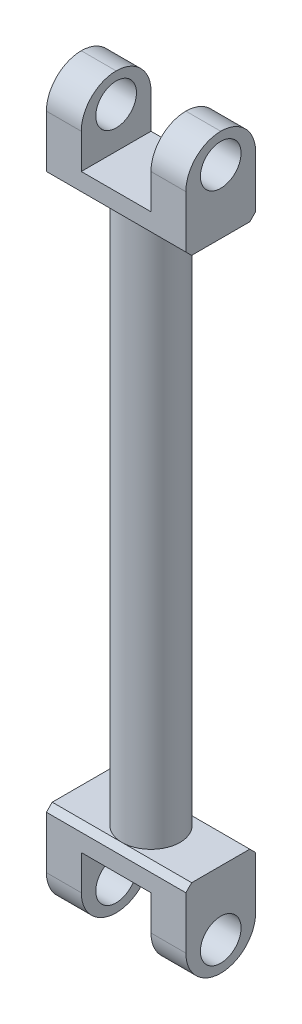
ISO-10303-21;
HEADER;
FILE_DESCRIPTION(('STEP AP214'),'2;1');
FILE_NAME('part.step','',(''),(''),'','','');
FILE_SCHEMA(('AUTOMOTIVE_DESIGN { 1 0 10303 214 1 1 1 1 }'));
ENDSEC;
DATA;
#1=APPLICATION_CONTEXT('core data for automotive mechanical design processes');
#2=APPLICATION_PROTOCOL_DEFINITION('international standard','automotive_design',2000,#1);
#3=PRODUCT_CONTEXT('',#1,'mechanical');
#4=PRODUCT('Part','Part','',(#3));
#5=PRODUCT_RELATED_PRODUCT_CATEGORY('part','',(#4));
#6=PRODUCT_DEFINITION_FORMATION('','',#4);
#7=PRODUCT_DEFINITION_CONTEXT('part definition',#1,'design');
#8=PRODUCT_DEFINITION('design','',#6,#7);
#9=PRODUCT_DEFINITION_SHAPE('','',#8);
#10=(LENGTH_UNIT() NAMED_UNIT(*) SI_UNIT(.MILLI.,.METRE.));
#11=(NAMED_UNIT(*) PLANE_ANGLE_UNIT() SI_UNIT($,.RADIAN.));
#12=(NAMED_UNIT(*) SI_UNIT($,.STERADIAN.) SOLID_ANGLE_UNIT());
#13=UNCERTAINTY_MEASURE_WITH_UNIT(LENGTH_MEASURE(1.E-05),#10,'distance_accuracy_value','');
#14=(GEOMETRIC_REPRESENTATION_CONTEXT(3) GLOBAL_UNCERTAINTY_ASSIGNED_CONTEXT((#13)) GLOBAL_UNIT_ASSIGNED_CONTEXT((#10,
#11,#12)) REPRESENTATION_CONTEXT('',''));
#15=CARTESIAN_POINT('',(0.,0.,0.));
#16=DIRECTION('',(0.,0.,1.));
#17=DIRECTION('',(1.,0.,0.));
#18=AXIS2_PLACEMENT_3D('',#15,#16,#17);
#19=CARTESIAN_POINT('',(0.,-23.375,0.));
#20=DIRECTION('',(0.,1.,0.));
#21=DIRECTION('',(0.,0.,-1.));
#22=AXIS2_PLACEMENT_3D('',#19,#20,#21);
#23=PLANE('',#22);
#24=DIRECTION('',(0.,0.,-1.));
#25=VECTOR('',#24,1.);
#26=CARTESIAN_POINT('',(6.,-23.375,3.));
#27=LINE('',#26,#25);
#28=CARTESIAN_POINT('',(6.,-23.375,2.5));
#29=VERTEX_POINT('',#28);
#30=CARTESIAN_POINT('',(6.,-23.375,-2.5));
#31=VERTEX_POINT('',#30);
#32=EDGE_CURVE('E247',#29,#31,#27,.T.);
#33=ORIENTED_EDGE('',*,*,#32,.T.);
#34=DIRECTION('',(-1.,0.,0.));
#35=VECTOR('',#34,1.);
#36=CARTESIAN_POINT('',(0.,-23.375,-2.5));
#37=LINE('',#36,#35);
#38=CARTESIAN_POINT('',(0.,-23.375,-2.5));
#39=VERTEX_POINT('',#38);
#40=EDGE_CURVE('E416',#31,#39,#37,.T.);
#41=ORIENTED_EDGE('',*,*,#40,.T.);
#42=CARTESIAN_POINT('',(0.,-23.375,0.));
#43=DIRECTION('',(0.,1.,0.));
#44=DIRECTION('',(0.,0.,1.));
#45=AXIS2_PLACEMENT_3D('',#42,#43,#44);
#46=CIRCLE('',#45,2.5);
#47=CARTESIAN_POINT('',(0.,-23.375,2.5));
#48=VERTEX_POINT('',#47);
#49=EDGE_CURVE('E318',#48,#39,#46,.T.);
#50=ORIENTED_EDGE('',*,*,#49,.F.);
#51=DIRECTION('',(1.,0.,0.));
#52=VECTOR('',#51,1.);
#53=CARTESIAN_POINT('',(0.,-23.375,2.5));
#54=LINE('',#53,#52);
#55=EDGE_CURVE('E402',#48,#29,#54,.T.);
#56=ORIENTED_EDGE('',*,*,#55,.T.);
#57=EDGE_LOOP('',(#33,#41,#50,#56));
#58=FACE_BOUND('',#57,.T.);
#59=ADVANCED_FACE('F37',(#58),#23,.T.);
#60=CARTESIAN_POINT('',(0.,23.375,0.));
#61=DIRECTION('',(0.,-1.,0.));
#62=DIRECTION('',(0.,0.,-1.));
#63=AXIS2_PLACEMENT_3D('',#60,#61,#62);
#64=PLANE('',#63);
#65=DIRECTION('',(0.,0.,1.));
#66=VECTOR('',#65,1.);
#67=CARTESIAN_POINT('',(-6.,23.375,3.));
#68=LINE('',#67,#66);
#69=CARTESIAN_POINT('',(-6.,23.375,-2.5));
#70=VERTEX_POINT('',#69);
#71=CARTESIAN_POINT('',(-6.,23.375,2.5));
#72=VERTEX_POINT('',#71);
#73=EDGE_CURVE('E294',#70,#72,#68,.T.);
#74=ORIENTED_EDGE('',*,*,#73,.F.);
#75=DIRECTION('',(1.,0.,0.));
#76=VECTOR('',#75,1.);
#77=CARTESIAN_POINT('',(6.,23.375,-2.5));
#78=LINE('',#77,#76);
#79=CARTESIAN_POINT('',(0.,23.375,-2.5));
#80=VERTEX_POINT('',#79);
#81=EDGE_CURVE('E366',#70,#80,#78,.T.);
#82=ORIENTED_EDGE('',*,*,#81,.T.);
#83=CARTESIAN_POINT('',(0.,23.375,0.));
#84=DIRECTION('',(0.,1.,0.));
#85=DIRECTION('',(0.,0.,1.));
#86=AXIS2_PLACEMENT_3D('',#83,#84,#85);
#87=CIRCLE('',#86,2.5);
#88=CARTESIAN_POINT('',(0.,23.375,2.5));
#89=VERTEX_POINT('',#88);
#90=EDGE_CURVE('E313',#80,#89,#87,.T.);
#91=ORIENTED_EDGE('',*,*,#90,.T.);
#92=DIRECTION('',(-1.,0.,0.));
#93=VECTOR('',#92,1.);
#94=CARTESIAN_POINT('',(-6.,23.375,2.5));
#95=LINE('',#94,#93);
#96=EDGE_CURVE('E360',#89,#72,#95,.T.);
#97=ORIENTED_EDGE('',*,*,#96,.T.);
#98=EDGE_LOOP('',(#74,#82,#91,#97));
#99=FACE_BOUND('',#98,.T.);
#100=ADVANCED_FACE('F459',(#99),#64,.T.);
#101=CARTESIAN_POINT('',(0.,25.375,0.));
#102=DIRECTION('',(0.,-1.,0.));
#103=DIRECTION('',(0.,0.,-1.));
#104=AXIS2_PLACEMENT_3D('',#101,#102,#103);
#105=PLANE('',#104);
#106=DIRECTION('',(0.,0.,1.));
#107=VECTOR('',#106,1.);
#108=CARTESIAN_POINT('',(3.,25.375,-3.));
#109=LINE('',#108,#107);
#110=CARTESIAN_POINT('',(3.,25.375,-3.));
#111=VERTEX_POINT('',#110);
#112=CARTESIAN_POINT('',(3.,25.375,3.));
#113=VERTEX_POINT('',#112);
#114=EDGE_CURVE('E275',#111,#113,#109,.T.);
#115=ORIENTED_EDGE('',*,*,#114,.F.);
#116=DIRECTION('',(-1.,0.,0.));
#117=VECTOR('',#116,1.);
#118=CARTESIAN_POINT('',(-6.,25.375,-3.));
#119=LINE('',#118,#117);
#120=CARTESIAN_POINT('',(-3.,25.375,-3.));
#121=VERTEX_POINT('',#120);
#122=EDGE_CURVE('E290',#111,#121,#119,.T.);
#123=ORIENTED_EDGE('',*,*,#122,.T.);
#124=DIRECTION('',(0.,0.,-1.));
#125=VECTOR('',#124,1.);
#126=CARTESIAN_POINT('',(-3.,25.375,-3.));
#127=LINE('',#126,#125);
#128=CARTESIAN_POINT('',(-3.,25.375,3.));
#129=VERTEX_POINT('',#128);
#130=EDGE_CURVE('E282',#129,#121,#127,.T.);
#131=ORIENTED_EDGE('',*,*,#130,.F.);
#132=DIRECTION('',(1.,0.,0.));
#133=VECTOR('',#132,1.);
#134=CARTESIAN_POINT('',(-6.,25.375,3.));
#135=LINE('',#134,#133);
#136=EDGE_CURVE('E293',#129,#113,#135,.T.);
#137=ORIENTED_EDGE('',*,*,#136,.T.);
#138=EDGE_LOOP('',(#115,#123,#131,#137));
#139=FACE_BOUND('',#138,.T.);
#140=ADVANCED_FACE('F449',(#139),#105,.F.);
#141=CARTESIAN_POINT('',(0.,23.375,0.));
#142=DIRECTION('',(0.,-1.,0.));
#143=DIRECTION('',(0.,0.,-1.));
#144=AXIS2_PLACEMENT_3D('',#141,#142,#143);
#145=CYLINDRICAL_SURFACE('',#144,2.5);
#146=EDGE_CURVE('E314',#89,#80,#87,.T.);
#147=ORIENTED_EDGE('',*,*,#146,.F.);
#148=ORIENTED_EDGE('',*,*,#90,.F.);
#149=EDGE_LOOP('',(#147,#148));
#150=FACE_BOUND('',#149,.T.);
#151=ORIENTED_EDGE('',*,*,#49,.T.);
#152=EDGE_CURVE('E263',#39,#48,#46,.T.);
#153=ORIENTED_EDGE('',*,*,#152,.T.);
#154=EDGE_LOOP('',(#151,#153));
#155=FACE_BOUND('',#154,.T.);
#156=ADVANCED_FACE('F446',(#150,#155),#145,.T.);
#157=CARTESIAN_POINT('',(6.,25.375,3.));
#158=DIRECTION('',(-1.,0.,0.));
#159=DIRECTION('',(0.,0.,1.));
#160=AXIS2_PLACEMENT_3D('',#157,#158,#159);
#161=PLANE('',#160);
#162=CARTESIAN_POINT('',(6.,28.875,0.));
#163=DIRECTION('',(-1.,0.,0.));
#164=DIRECTION('',(0.,0.,1.));
#165=AXIS2_PLACEMENT_3D('',#162,#163,#164);
#166=CIRCLE('',#165,1.75);
#167=CARTESIAN_POINT('',(6.,28.875,1.75));
#168=VERTEX_POINT('',#167);
#169=EDGE_CURVE('E264',#168,#168,#166,.T.);
#170=ORIENTED_EDGE('',*,*,#169,.T.);
#171=EDGE_LOOP('',(#170));
#172=FACE_BOUND('',#171,.T.);
#173=DIRECTION('',(0.,0.,-1.));
#174=VECTOR('',#173,1.);
#175=CARTESIAN_POINT('',(6.,23.375,3.));
#176=LINE('',#175,#174);
#177=CARTESIAN_POINT('',(6.,23.375,2.5));
#178=VERTEX_POINT('',#177);
#179=CARTESIAN_POINT('',(6.,23.375,-2.5));
#180=VERTEX_POINT('',#179);
#181=EDGE_CURVE('E289',#178,#180,#176,.T.);
#182=ORIENTED_EDGE('',*,*,#181,.T.);
#183=DIRECTION('',(0.,0.707106781186543,-0.707106781186552));
#184=VECTOR('',#183,1.);
#185=CARTESIAN_POINT('',(6.,23.875,-3.));
#186=LINE('',#185,#184);
#187=CARTESIAN_POINT('',(6.,23.875,-3.));
#188=VERTEX_POINT('',#187);
#189=EDGE_CURVE('E370',#180,#188,#186,.T.);
#190=ORIENTED_EDGE('',*,*,#189,.T.);
#191=DIRECTION('',(0.,-1.,0.));
#192=VECTOR('',#191,1.);
#193=CARTESIAN_POINT('',(6.,25.375,-3.));
#194=LINE('',#193,#192);
#195=CARTESIAN_POINT('',(6.,28.375,-3.));
#196=VERTEX_POINT('',#195);
#197=EDGE_CURVE('E310',#196,#188,#194,.T.);
#198=ORIENTED_EDGE('',*,*,#197,.F.);
#199=CARTESIAN_POINT('',(6.,28.375,0.));
#200=DIRECTION('',(-1.,0.,0.));
#201=DIRECTION('',(0.,0.,1.));
#202=AXIS2_PLACEMENT_3D('',#199,#200,#201);
#203=CIRCLE('',#202,3.);
#204=CARTESIAN_POINT('',(6.,31.375,0.));
#205=VERTEX_POINT('',#204);
#206=EDGE_CURVE('E317',#196,#205,#203,.F.);
#207=ORIENTED_EDGE('',*,*,#206,.T.);
#208=CARTESIAN_POINT('',(6.,28.375,0.));
#209=DIRECTION('',(-1.,0.,0.));
#210=DIRECTION('',(0.,0.,1.));
#211=AXIS2_PLACEMENT_3D('',#208,#209,#210);
#212=CIRCLE('',#211,3.);
#213=CARTESIAN_POINT('',(6.,28.375,3.));
#214=VERTEX_POINT('',#213);
#215=EDGE_CURVE('E325',#205,#214,#212,.F.);
#216=ORIENTED_EDGE('',*,*,#215,.T.);
#217=DIRECTION('',(0.,-1.,0.));
#218=VECTOR('',#217,1.);
#219=CARTESIAN_POINT('',(6.,25.375,3.));
#220=LINE('',#219,#218);
#221=CARTESIAN_POINT('',(6.,23.875,3.));
#222=VERTEX_POINT('',#221);
#223=EDGE_CURVE('E297',#214,#222,#220,.T.);
#224=ORIENTED_EDGE('',*,*,#223,.T.);
#225=DIRECTION('',(0.,-0.707106781186543,-0.707106781186552));
#226=VECTOR('',#225,1.);
#227=CARTESIAN_POINT('',(6.,23.875,3.));
#228=LINE('',#227,#226);
#229=EDGE_CURVE('E368',#222,#178,#228,.T.);
#230=ORIENTED_EDGE('',*,*,#229,.T.);
#231=EDGE_LOOP('',(#182,#190,#198,#207,#216,#224,#230));
#232=FACE_BOUND('',#231,.T.);
#233=ADVANCED_FACE('F448',(#172,#232),#161,.F.);
#234=CARTESIAN_POINT('',(-6.,25.375,-3.));
#235=DIRECTION('',(0.,0.,1.));
#236=DIRECTION('',(1.,0.,0.));
#237=AXIS2_PLACEMENT_3D('',#234,#235,#236);
#238=PLANE('',#237);
#239=ORIENTED_EDGE('',*,*,#197,.T.);
#240=DIRECTION('',(-1.,0.,0.));
#241=VECTOR('',#240,1.);
#242=CARTESIAN_POINT('',(-6.,23.875,-3.));
#243=LINE('',#242,#241);
#244=CARTESIAN_POINT('',(-6.,23.875,-3.));
#245=VERTEX_POINT('',#244);
#246=EDGE_CURVE('E349',#188,#245,#243,.T.);
#247=ORIENTED_EDGE('',*,*,#246,.T.);
#248=DIRECTION('',(0.,-1.,0.));
#249=VECTOR('',#248,1.);
#250=CARTESIAN_POINT('',(-6.,25.375,-3.));
#251=LINE('',#250,#249);
#252=CARTESIAN_POINT('',(-6.,28.375,-3.));
#253=VERTEX_POINT('',#252);
#254=EDGE_CURVE('E307',#253,#245,#251,.T.);
#255=ORIENTED_EDGE('',*,*,#254,.F.);
#256=DIRECTION('',(-1.,0.,0.));
#257=VECTOR('',#256,1.);
#258=CARTESIAN_POINT('',(-3.,28.375,-3.));
#259=LINE('',#258,#257);
#260=CARTESIAN_POINT('',(-3.,28.375,-3.));
#261=VERTEX_POINT('',#260);
#262=EDGE_CURVE('E337',#253,#261,#259,.F.);
#263=ORIENTED_EDGE('',*,*,#262,.T.);
#264=DIRECTION('',(0.,-1.,0.));
#265=VECTOR('',#264,1.);
#266=CARTESIAN_POINT('',(-3.,31.375,-3.));
#267=LINE('',#266,#265);
#268=EDGE_CURVE('E285',#261,#121,#267,.T.);
#269=ORIENTED_EDGE('',*,*,#268,.T.);
#270=ORIENTED_EDGE('',*,*,#122,.F.);
#271=DIRECTION('',(0.,-1.,0.));
#272=VECTOR('',#271,1.);
#273=CARTESIAN_POINT('',(3.,31.375,-3.));
#274=LINE('',#273,#272);
#275=CARTESIAN_POINT('',(3.,28.375,-3.));
#276=VERTEX_POINT('',#275);
#277=EDGE_CURVE('E280',#276,#111,#274,.T.);
#278=ORIENTED_EDGE('',*,*,#277,.F.);
#279=DIRECTION('',(-1.,0.,0.));
#280=VECTOR('',#279,1.);
#281=CARTESIAN_POINT('',(-6.,28.375,-3.));
#282=LINE('',#281,#280);
#283=EDGE_CURVE('E339',#276,#196,#282,.F.);
#284=ORIENTED_EDGE('',*,*,#283,.T.);
#285=EDGE_LOOP('',(#239,#247,#255,#263,#269,#270,#278,#284));
#286=FACE_BOUND('',#285,.T.);
#287=ADVANCED_FACE('F456',(#286),#238,.F.);
#288=CARTESIAN_POINT('',(-6.,25.375,3.));
#289=DIRECTION('',(1.,0.,0.));
#290=DIRECTION('',(0.,0.,-1.));
#291=AXIS2_PLACEMENT_3D('',#288,#289,#290);
#292=PLANE('',#291);
#293=CARTESIAN_POINT('',(-6.,28.875,0.));
#294=DIRECTION('',(-1.,0.,0.));
#295=DIRECTION('',(0.,0.,1.));
#296=AXIS2_PLACEMENT_3D('',#293,#294,#295);
#297=CIRCLE('',#296,1.75);
#298=CARTESIAN_POINT('',(-6.,28.875,1.75));
#299=VERTEX_POINT('',#298);
#300=EDGE_CURVE('E268',#299,#299,#297,.T.);
#301=ORIENTED_EDGE('',*,*,#300,.F.);
#302=EDGE_LOOP('',(#301));
#303=FACE_BOUND('',#302,.T.);
#304=ORIENTED_EDGE('',*,*,#254,.T.);
#305=DIRECTION('',(0.,-0.707106781186543,0.707106781186552));
#306=VECTOR('',#305,1.);
#307=CARTESIAN_POINT('',(-6.,23.875,-3.));
#308=LINE('',#307,#306);
#309=EDGE_CURVE('E358',#245,#70,#308,.T.);
#310=ORIENTED_EDGE('',*,*,#309,.T.);
#311=ORIENTED_EDGE('',*,*,#73,.T.);
#312=DIRECTION('',(0.,0.707106781186543,0.707106781186552));
#313=VECTOR('',#312,1.);
#314=CARTESIAN_POINT('',(-6.,23.875,3.));
#315=LINE('',#314,#313);
#316=CARTESIAN_POINT('',(-6.,23.875,3.));
#317=VERTEX_POINT('',#316);
#318=EDGE_CURVE('E356',#72,#317,#315,.T.);
#319=ORIENTED_EDGE('',*,*,#318,.T.);
#320=DIRECTION('',(0.,-1.,0.));
#321=VECTOR('',#320,1.);
#322=CARTESIAN_POINT('',(-6.,25.375,3.));
#323=LINE('',#322,#321);
#324=CARTESIAN_POINT('',(-6.,28.375,3.));
#325=VERTEX_POINT('',#324);
#326=EDGE_CURVE('E304',#325,#317,#323,.T.);
#327=ORIENTED_EDGE('',*,*,#326,.F.);
#328=CARTESIAN_POINT('',(-6.,28.375,0.));
#329=DIRECTION('',(1.,0.,0.));
#330=DIRECTION('',(0.,0.,-1.));
#331=AXIS2_PLACEMENT_3D('',#328,#329,#330);
#332=CIRCLE('',#331,3.);
#333=CARTESIAN_POINT('',(-6.,31.375,0.));
#334=VERTEX_POINT('',#333);
#335=EDGE_CURVE('E347',#325,#334,#332,.F.);
#336=ORIENTED_EDGE('',*,*,#335,.T.);
#337=CARTESIAN_POINT('',(-6.,28.375,0.));
#338=DIRECTION('',(1.,0.,0.));
#339=DIRECTION('',(0.,0.,-1.));
#340=AXIS2_PLACEMENT_3D('',#337,#338,#339);
#341=CIRCLE('',#340,3.);
#342=EDGE_CURVE('E345',#334,#253,#341,.F.);
#343=ORIENTED_EDGE('',*,*,#342,.T.);
#344=EDGE_LOOP('',(#304,#310,#311,#319,#327,#336,#343));
#345=FACE_BOUND('',#344,.T.);
#346=ADVANCED_FACE('F692',(#303,#345),#292,.F.);
#347=CARTESIAN_POINT('',(-6.,25.375,3.));
#348=DIRECTION('',(0.,0.,-1.));
#349=DIRECTION('',(-1.,0.,0.));
#350=AXIS2_PLACEMENT_3D('',#347,#348,#349);
#351=PLANE('',#350);
#352=ORIENTED_EDGE('',*,*,#326,.T.);
#353=DIRECTION('',(1.,0.,0.));
#354=VECTOR('',#353,1.);
#355=CARTESIAN_POINT('',(6.,23.875,3.));
#356=LINE('',#355,#354);
#357=EDGE_CURVE('E372',#317,#222,#356,.T.);
#358=ORIENTED_EDGE('',*,*,#357,.T.);
#359=ORIENTED_EDGE('',*,*,#223,.F.);
#360=DIRECTION('',(1.,0.,0.));
#361=VECTOR('',#360,1.);
#362=CARTESIAN_POINT('',(-6.,28.375,3.));
#363=LINE('',#362,#361);
#364=CARTESIAN_POINT('',(3.,28.375,3.));
#365=VERTEX_POINT('',#364);
#366=EDGE_CURVE('E330',#214,#365,#363,.F.);
#367=ORIENTED_EDGE('',*,*,#366,.T.);
#368=DIRECTION('',(0.,-1.,0.));
#369=VECTOR('',#368,1.);
#370=CARTESIAN_POINT('',(3.,31.375,3.));
#371=LINE('',#370,#369);
#372=EDGE_CURVE('E278',#365,#113,#371,.T.);
#373=ORIENTED_EDGE('',*,*,#372,.T.);
#374=ORIENTED_EDGE('',*,*,#136,.F.);
#375=DIRECTION('',(0.,-1.,0.));
#376=VECTOR('',#375,1.);
#377=CARTESIAN_POINT('',(-3.,31.375,3.));
#378=LINE('',#377,#376);
#379=CARTESIAN_POINT('',(-3.,28.375,3.));
#380=VERTEX_POINT('',#379);
#381=EDGE_CURVE('E287',#380,#129,#378,.T.);
#382=ORIENTED_EDGE('',*,*,#381,.F.);
#383=DIRECTION('',(1.,0.,0.));
#384=VECTOR('',#383,1.);
#385=CARTESIAN_POINT('',(-6.,28.375,3.));
#386=LINE('',#385,#384);
#387=EDGE_CURVE('E327',#380,#325,#386,.F.);
#388=ORIENTED_EDGE('',*,*,#387,.T.);
#389=EDGE_LOOP('',(#352,#358,#359,#367,#373,#374,#382,#388));
#390=FACE_BOUND('',#389,.T.);
#391=ADVANCED_FACE('F680',(#390),#351,.F.);
#392=ORIENTED_EDGE('',*,*,#146,.T.);
#393=DIRECTION('',(1.,0.,0.));
#394=VECTOR('',#393,1.);
#395=CARTESIAN_POINT('',(6.,23.375,-2.5));
#396=LINE('',#395,#394);
#397=EDGE_CURVE('E364',#80,#180,#396,.T.);
#398=ORIENTED_EDGE('',*,*,#397,.T.);
#399=ORIENTED_EDGE('',*,*,#181,.F.);
#400=DIRECTION('',(-1.,0.,0.));
#401=VECTOR('',#400,1.);
#402=CARTESIAN_POINT('',(-6.,23.375,2.5));
#403=LINE('',#402,#401);
#404=EDGE_CURVE('E362',#178,#89,#403,.T.);
#405=ORIENTED_EDGE('',*,*,#404,.T.);
#406=EDGE_LOOP('',(#392,#398,#399,#405));
#407=FACE_BOUND('',#406,.T.);
#408=ADVANCED_FACE('F471',(#407),#64,.T.);
#409=CARTESIAN_POINT('',(-3.,31.375,-3.));
#410=DIRECTION('',(-1.,0.,0.));
#411=DIRECTION('',(0.,0.,1.));
#412=AXIS2_PLACEMENT_3D('',#409,#410,#411);
#413=PLANE('',#412);
#414=CARTESIAN_POINT('',(-3.,28.875,0.));
#415=DIRECTION('',(-1.,0.,0.));
#416=DIRECTION('',(0.,0.,1.));
#417=AXIS2_PLACEMENT_3D('',#414,#415,#416);
#418=CIRCLE('',#417,1.75);
#419=CARTESIAN_POINT('',(-3.,28.875,1.75));
#420=VERTEX_POINT('',#419);
#421=EDGE_CURVE('E272',#420,#420,#418,.T.);
#422=ORIENTED_EDGE('',*,*,#421,.T.);
#423=EDGE_LOOP('',(#422));
#424=FACE_BOUND('',#423,.T.);
#425=CARTESIAN_POINT('',(-3.,28.375,0.));
#426=DIRECTION('',(-1.,0.,0.));
#427=DIRECTION('',(0.,0.,1.));
#428=AXIS2_PLACEMENT_3D('',#425,#426,#427);
#429=CIRCLE('',#428,3.);
#430=CARTESIAN_POINT('',(-3.,31.375,0.));
#431=VERTEX_POINT('',#430);
#432=EDGE_CURVE('E341',#261,#431,#429,.F.);
#433=ORIENTED_EDGE('',*,*,#432,.T.);
#434=CARTESIAN_POINT('',(-3.,28.375,0.));
#435=DIRECTION('',(-1.,0.,0.));
#436=DIRECTION('',(0.,0.,1.));
#437=AXIS2_PLACEMENT_3D('',#434,#435,#436);
#438=CIRCLE('',#437,3.);
#439=EDGE_CURVE('E343',#431,#380,#438,.F.);
#440=ORIENTED_EDGE('',*,*,#439,.T.);
#441=ORIENTED_EDGE('',*,*,#381,.T.);
#442=ORIENTED_EDGE('',*,*,#130,.T.);
#443=ORIENTED_EDGE('',*,*,#268,.F.);
#444=EDGE_LOOP('',(#433,#440,#441,#442,#443));
#445=FACE_BOUND('',#444,.T.);
#446=ADVANCED_FACE('F679',(#424,#445),#413,.F.);
#447=CARTESIAN_POINT('',(3.,31.375,-3.));
#448=DIRECTION('',(1.,0.,0.));
#449=DIRECTION('',(0.,0.,-1.));
#450=AXIS2_PLACEMENT_3D('',#447,#448,#449);
#451=PLANE('',#450);
#452=CARTESIAN_POINT('',(3.,28.875,0.));
#453=DIRECTION('',(1.,0.,0.));
#454=DIRECTION('',(0.,0.,-1.));
#455=AXIS2_PLACEMENT_3D('',#452,#453,#454);
#456=CIRCLE('',#455,1.75);
#457=CARTESIAN_POINT('',(3.,28.875,-1.75));
#458=VERTEX_POINT('',#457);
#459=EDGE_CURVE('E267',#458,#458,#456,.T.);
#460=ORIENTED_EDGE('',*,*,#459,.T.);
#461=EDGE_LOOP('',(#460));
#462=FACE_BOUND('',#461,.T.);
#463=ORIENTED_EDGE('',*,*,#372,.F.);
#464=CARTESIAN_POINT('',(3.,28.375,0.));
#465=DIRECTION('',(1.,0.,0.));
#466=DIRECTION('',(0.,0.,-1.));
#467=AXIS2_PLACEMENT_3D('',#464,#465,#466);
#468=CIRCLE('',#467,3.);
#469=CARTESIAN_POINT('',(3.,31.375,0.));
#470=VERTEX_POINT('',#469);
#471=EDGE_CURVE('E335',#365,#470,#468,.F.);
#472=ORIENTED_EDGE('',*,*,#471,.T.);
#473=CARTESIAN_POINT('',(3.,28.375,0.));
#474=DIRECTION('',(1.,0.,0.));
#475=DIRECTION('',(0.,0.,-1.));
#476=AXIS2_PLACEMENT_3D('',#473,#474,#475);
#477=CIRCLE('',#476,3.);
#478=EDGE_CURVE('E333',#470,#276,#477,.F.);
#479=ORIENTED_EDGE('',*,*,#478,.T.);
#480=ORIENTED_EDGE('',*,*,#277,.T.);
#481=ORIENTED_EDGE('',*,*,#114,.T.);
#482=EDGE_LOOP('',(#463,#472,#479,#480,#481));
#483=FACE_BOUND('',#482,.T.);
#484=ADVANCED_FACE('F771',(#462,#483),#451,.F.);
#485=CARTESIAN_POINT('',(6.,28.875,0.));
#486=DIRECTION('',(-1.,0.,0.));
#487=DIRECTION('',(0.,0.,1.));
#488=AXIS2_PLACEMENT_3D('',#485,#486,#487);
#489=CYLINDRICAL_SURFACE('',#488,1.75);
#490=ORIENTED_EDGE('',*,*,#169,.F.);
#491=EDGE_LOOP('',(#490));
#492=FACE_BOUND('',#491,.T.);
#493=ORIENTED_EDGE('',*,*,#459,.F.);
#494=EDGE_LOOP('',(#493));
#495=FACE_BOUND('',#494,.T.);
#496=ADVANCED_FACE('F776',(#492,#495),#489,.F.);
#497=ORIENTED_EDGE('',*,*,#300,.T.);
#498=EDGE_LOOP('',(#497));
#499=FACE_BOUND('',#498,.T.);
#500=ORIENTED_EDGE('',*,*,#421,.F.);
#501=EDGE_LOOP('',(#500));
#502=FACE_BOUND('',#501,.T.);
#503=ADVANCED_FACE('F763',(#499,#502),#489,.F.);
#504=CARTESIAN_POINT('',(0.,28.375,0.));
#505=DIRECTION('',(-1.,0.,0.));
#506=DIRECTION('',(0.,0.,1.));
#507=AXIS2_PLACEMENT_3D('',#504,#505,#506);
#508=CYLINDRICAL_SURFACE('',#507,3.);
#509=ORIENTED_EDGE('',*,*,#283,.F.);
#510=ORIENTED_EDGE('',*,*,#478,.F.);
#511=DIRECTION('',(-1.,0.,0.));
#512=VECTOR('',#511,1.);
#513=CARTESIAN_POINT('',(0.,31.375,0.));
#514=LINE('',#513,#512);
#515=EDGE_CURVE('E271',#205,#470,#514,.T.);
#516=ORIENTED_EDGE('',*,*,#515,.F.);
#517=ORIENTED_EDGE('',*,*,#206,.F.);
#518=EDGE_LOOP('',(#509,#510,#516,#517));
#519=FACE_BOUND('',#518,.T.);
#520=ADVANCED_FACE('F754',(#519),#508,.T.);
#521=CARTESIAN_POINT('',(0.,28.375,0.));
#522=DIRECTION('',(1.,0.,0.));
#523=DIRECTION('',(0.,0.,-1.));
#524=AXIS2_PLACEMENT_3D('',#521,#522,#523);
#525=CYLINDRICAL_SURFACE('',#524,3.);
#526=ORIENTED_EDGE('',*,*,#471,.F.);
#527=ORIENTED_EDGE('',*,*,#366,.F.);
#528=ORIENTED_EDGE('',*,*,#215,.F.);
#529=ORIENTED_EDGE('',*,*,#515,.T.);
#530=EDGE_LOOP('',(#526,#527,#528,#529));
#531=FACE_BOUND('',#530,.T.);
#532=ADVANCED_FACE('F744',(#531),#525,.T.);
#533=CARTESIAN_POINT('',(0.,28.375,0.));
#534=DIRECTION('',(1.,0.,0.));
#535=DIRECTION('',(0.,0.,-1.));
#536=AXIS2_PLACEMENT_3D('',#533,#534,#535);
#537=CYLINDRICAL_SURFACE('',#536,3.);
#538=ORIENTED_EDGE('',*,*,#262,.F.);
#539=ORIENTED_EDGE('',*,*,#342,.F.);
#540=DIRECTION('',(-1.,0.,0.));
#541=VECTOR('',#540,1.);
#542=CARTESIAN_POINT('',(-6.,31.375,0.));
#543=LINE('',#542,#541);
#544=EDGE_CURVE('E321',#431,#334,#543,.T.);
#545=ORIENTED_EDGE('',*,*,#544,.F.);
#546=ORIENTED_EDGE('',*,*,#432,.F.);
#547=EDGE_LOOP('',(#538,#539,#545,#546));
#548=FACE_BOUND('',#547,.T.);
#549=ADVANCED_FACE('F734',(#548),#537,.T.);
#550=CARTESIAN_POINT('',(0.,28.375,0.));
#551=DIRECTION('',(-1.,0.,0.));
#552=DIRECTION('',(0.,0.,1.));
#553=AXIS2_PLACEMENT_3D('',#550,#551,#552);
#554=CYLINDRICAL_SURFACE('',#553,3.);
#555=ORIENTED_EDGE('',*,*,#335,.F.);
#556=ORIENTED_EDGE('',*,*,#387,.F.);
#557=ORIENTED_EDGE('',*,*,#439,.F.);
#558=ORIENTED_EDGE('',*,*,#544,.T.);
#559=EDGE_LOOP('',(#555,#556,#557,#558));
#560=FACE_BOUND('',#559,.T.);
#561=ADVANCED_FACE('F667',(#560),#554,.T.);
#562=CARTESIAN_POINT('',(-6.,23.875,-3.));
#563=DIRECTION('',(0.,-0.707106781186552,-0.707106781186543));
#564=DIRECTION('',(1.,0.,0.));
#565=AXIS2_PLACEMENT_3D('',#562,#563,#564);
#566=PLANE('',#565);
#567=ORIENTED_EDGE('',*,*,#397,.F.);
#568=ORIENTED_EDGE('',*,*,#81,.F.);
#569=ORIENTED_EDGE('',*,*,#309,.F.);
#570=ORIENTED_EDGE('',*,*,#246,.F.);
#571=ORIENTED_EDGE('',*,*,#189,.F.);
#572=EDGE_LOOP('',(#567,#568,#569,#570,#571));
#573=FACE_BOUND('',#572,.T.);
#574=ADVANCED_FACE('F657',(#573),#566,.T.);
#575=CARTESIAN_POINT('',(-6.,23.875,3.));
#576=DIRECTION('',(0.,-0.707106781186552,0.707106781186543));
#577=DIRECTION('',(-1.,0.,0.));
#578=AXIS2_PLACEMENT_3D('',#575,#576,#577);
#579=PLANE('',#578);
#580=ORIENTED_EDGE('',*,*,#96,.F.);
#581=ORIENTED_EDGE('',*,*,#404,.F.);
#582=ORIENTED_EDGE('',*,*,#229,.F.);
#583=ORIENTED_EDGE('',*,*,#357,.F.);
#584=ORIENTED_EDGE('',*,*,#318,.F.);
#585=EDGE_LOOP('',(#580,#581,#582,#583,#584));
#586=FACE_BOUND('',#585,.T.);
#587=ADVANCED_FACE('F638',(#586),#579,.T.);
#588=CARTESIAN_POINT('',(6.,-25.375,3.));
#589=DIRECTION('',(1.,0.,0.));
#590=DIRECTION('',(0.,0.,-1.));
#591=AXIS2_PLACEMENT_3D('',#588,#589,#590);
#592=PLANE('',#591);
#593=CARTESIAN_POINT('',(6.,-28.875,0.));
#594=DIRECTION('',(1.,0.,0.));
#595=DIRECTION('',(0.,0.,1.));
#596=AXIS2_PLACEMENT_3D('',#593,#594,#595);
#597=CIRCLE('',#596,1.75);
#598=CARTESIAN_POINT('',(6.,-28.875,1.75));
#599=VERTEX_POINT('',#598);
#600=EDGE_CURVE('E379',#599,#599,#597,.T.);
#601=ORIENTED_EDGE('',*,*,#600,.F.);
#602=EDGE_LOOP('',(#601));
#603=FACE_BOUND('',#602,.T.);
#604=DIRECTION('',(0.,1.,0.));
#605=VECTOR('',#604,1.);
#606=CARTESIAN_POINT('',(6.,-25.375,-3.));
#607=LINE('',#606,#605);
#608=CARTESIAN_POINT('',(6.,-28.375,-3.));
#609=VERTEX_POINT('',#608);
#610=CARTESIAN_POINT('',(6.,-23.875,-3.));
#611=VERTEX_POINT('',#610);
#612=EDGE_CURVE('E244',#609,#611,#607,.T.);
#613=ORIENTED_EDGE('',*,*,#612,.T.);
#614=DIRECTION('',(0.,-0.707106781186543,-0.707106781186552));
#615=VECTOR('',#614,1.);
#616=CARTESIAN_POINT('',(6.,-21.625,-0.749999999999963));
#617=LINE('',#616,#615);
#618=EDGE_CURVE('E45',#611,#31,#617,.F.);
#619=ORIENTED_EDGE('',*,*,#618,.T.);
#620=ORIENTED_EDGE('',*,*,#32,.F.);
#621=DIRECTION('',(0.,0.707106781186543,-0.707106781186552));
#622=VECTOR('',#621,1.);
#623=CARTESIAN_POINT('',(6.,-24.625,3.75));
#624=LINE('',#623,#622);
#625=CARTESIAN_POINT('',(6.,-23.875,3.));
#626=VERTEX_POINT('',#625);
#627=EDGE_CURVE('E52',#29,#626,#624,.F.);
#628=ORIENTED_EDGE('',*,*,#627,.T.);
#629=DIRECTION('',(0.,1.,0.));
#630=VECTOR('',#629,1.);
#631=CARTESIAN_POINT('',(6.,-25.375,3.));
#632=LINE('',#631,#630);
#633=CARTESIAN_POINT('',(6.,-28.375,3.));
#634=VERTEX_POINT('',#633);
#635=EDGE_CURVE('E261',#634,#626,#632,.T.);
#636=ORIENTED_EDGE('',*,*,#635,.F.);
#637=CARTESIAN_POINT('',(6.,-28.375,0.));
#638=DIRECTION('',(1.,0.,0.));
#639=DIRECTION('',(0.,0.,-1.));
#640=AXIS2_PLACEMENT_3D('',#637,#638,#639);
#641=CIRCLE('',#640,3.);
#642=CARTESIAN_POINT('',(6.,-31.375,0.));
#643=VERTEX_POINT('',#642);
#644=EDGE_CURVE('E385',#634,#643,#641,.T.);
#645=ORIENTED_EDGE('',*,*,#644,.T.);
#646=CARTESIAN_POINT('',(6.,-28.375,0.));
#647=DIRECTION('',(1.,0.,0.));
#648=DIRECTION('',(0.,0.,-1.));
#649=AXIS2_PLACEMENT_3D('',#646,#647,#648);
#650=CIRCLE('',#649,3.);
#651=EDGE_CURVE('E383',#643,#609,#650,.T.);
#652=ORIENTED_EDGE('',*,*,#651,.T.);
#653=EDGE_LOOP('',(#613,#619,#620,#628,#636,#645,#652));
#654=FACE_BOUND('',#653,.T.);
#655=ADVANCED_FACE('F425',(#603,#654),#592,.T.);
#656=CARTESIAN_POINT('',(-6.,-25.375,3.));
#657=DIRECTION('',(0.,0.,1.));
#658=DIRECTION('',(1.,0.,0.));
#659=AXIS2_PLACEMENT_3D('',#656,#657,#658);
#660=PLANE('',#659);
#661=ORIENTED_EDGE('',*,*,#635,.T.);
#662=DIRECTION('',(-1.,0.,0.));
#663=VECTOR('',#662,1.);
#664=CARTESIAN_POINT('',(-6.,-23.875,3.));
#665=LINE('',#664,#663);
#666=CARTESIAN_POINT('',(-6.,-23.875,3.));
#667=VERTEX_POINT('',#666);
#668=EDGE_CURVE('E11',#626,#667,#665,.T.);
#669=ORIENTED_EDGE('',*,*,#668,.T.);
#670=DIRECTION('',(0.,1.,0.));
#671=VECTOR('',#670,1.);
#672=CARTESIAN_POINT('',(-6.,-25.375,3.));
#673=LINE('',#672,#671);
#674=CARTESIAN_POINT('',(-6.,-28.375,3.));
#675=VERTEX_POINT('',#674);
#676=EDGE_CURVE('E258',#675,#667,#673,.T.);
#677=ORIENTED_EDGE('',*,*,#676,.F.);
#678=DIRECTION('',(1.,0.,0.));
#679=VECTOR('',#678,1.);
#680=CARTESIAN_POINT('',(-6.,-28.375,3.));
#681=LINE('',#680,#679);
#682=CARTESIAN_POINT('',(-3.,-28.375,3.));
#683=VERTEX_POINT('',#682);
#684=EDGE_CURVE('E375',#675,#683,#681,.T.);
#685=ORIENTED_EDGE('',*,*,#684,.T.);
#686=DIRECTION('',(0.,1.,0.));
#687=VECTOR('',#686,1.);
#688=CARTESIAN_POINT('',(-3.,-31.375,3.));
#689=LINE('',#688,#687);
#690=CARTESIAN_POINT('',(-3.,-25.375,3.));
#691=VERTEX_POINT('',#690);
#692=EDGE_CURVE('E240',#683,#691,#689,.T.);
#693=ORIENTED_EDGE('',*,*,#692,.T.);
#694=DIRECTION('',(1.,0.,0.));
#695=VECTOR('',#694,1.);
#696=CARTESIAN_POINT('',(-6.,-25.375,3.));
#697=LINE('',#696,#695);
#698=CARTESIAN_POINT('',(3.,-25.375,3.));
#699=VERTEX_POINT('',#698);
#700=EDGE_CURVE('E232',#691,#699,#697,.T.);
#701=ORIENTED_EDGE('',*,*,#700,.T.);
#702=DIRECTION('',(0.,1.,0.));
#703=VECTOR('',#702,1.);
#704=CARTESIAN_POINT('',(3.,-31.375,3.));
#705=LINE('',#704,#703);
#706=CARTESIAN_POINT('',(3.,-28.375,3.));
#707=VERTEX_POINT('',#706);
#708=EDGE_CURVE('E213',#707,#699,#705,.T.);
#709=ORIENTED_EDGE('',*,*,#708,.F.);
#710=DIRECTION('',(1.,0.,0.));
#711=VECTOR('',#710,1.);
#712=CARTESIAN_POINT('',(6.,-28.375,3.));
#713=LINE('',#712,#711);
#714=EDGE_CURVE('E381',#707,#634,#713,.T.);
#715=ORIENTED_EDGE('',*,*,#714,.T.);
#716=EDGE_LOOP('',(#661,#669,#677,#685,#693,#701,#709,#715));
#717=FACE_BOUND('',#716,.T.);
#718=ADVANCED_FACE('F237',(#717),#660,.T.);
#719=CARTESIAN_POINT('',(-6.,-25.375,3.));
#720=DIRECTION('',(-1.,0.,0.));
#721=DIRECTION('',(0.,0.,1.));
#722=AXIS2_PLACEMENT_3D('',#719,#720,#721);
#723=PLANE('',#722);
#724=CARTESIAN_POINT('',(-6.,-28.875,0.));
#725=DIRECTION('',(1.,0.,0.));
#726=DIRECTION('',(0.,0.,1.));
#727=AXIS2_PLACEMENT_3D('',#724,#725,#726);
#728=CIRCLE('',#727,1.75);
#729=CARTESIAN_POINT('',(-6.,-28.875,1.75));
#730=VERTEX_POINT('',#729);
#731=EDGE_CURVE('E406',#730,#730,#728,.T.);
#732=ORIENTED_EDGE('',*,*,#731,.T.);
#733=EDGE_LOOP('',(#732));
#734=FACE_BOUND('',#733,.T.);
#735=DIRECTION('',(0.,0.,1.));
#736=VECTOR('',#735,1.);
#737=CARTESIAN_POINT('',(-6.,-23.375,3.));
#738=LINE('',#737,#736);
#739=CARTESIAN_POINT('',(-6.,-23.375,-2.5));
#740=VERTEX_POINT('',#739);
#741=CARTESIAN_POINT('',(-6.,-23.375,2.5));
#742=VERTEX_POINT('',#741);
#743=EDGE_CURVE('E242',#740,#742,#738,.T.);
#744=ORIENTED_EDGE('',*,*,#743,.F.);
#745=DIRECTION('',(0.,0.707106781186543,0.707106781186552));
#746=VECTOR('',#745,1.);
#747=CARTESIAN_POINT('',(-6.,-21.625,-0.749999999999963));
#748=LINE('',#747,#746);
#749=CARTESIAN_POINT('',(-6.,-23.875,-3.));
#750=VERTEX_POINT('',#749);
#751=EDGE_CURVE('E421',#740,#750,#748,.F.);
#752=ORIENTED_EDGE('',*,*,#751,.T.);
#753=DIRECTION('',(0.,1.,0.));
#754=VECTOR('',#753,1.);
#755=CARTESIAN_POINT('',(-6.,-25.375,-3.));
#756=LINE('',#755,#754);
#757=CARTESIAN_POINT('',(-6.,-28.375,-3.));
#758=VERTEX_POINT('',#757);
#759=EDGE_CURVE('E256',#758,#750,#756,.T.);
#760=ORIENTED_EDGE('',*,*,#759,.F.);
#761=CARTESIAN_POINT('',(-6.,-28.375,0.));
#762=DIRECTION('',(-1.,0.,0.));
#763=DIRECTION('',(0.,0.,1.));
#764=AXIS2_PLACEMENT_3D('',#761,#762,#763);
#765=CIRCLE('',#764,3.);
#766=CARTESIAN_POINT('',(-6.,-31.375,0.));
#767=VERTEX_POINT('',#766);
#768=EDGE_CURVE('E398',#758,#767,#765,.T.);
#769=ORIENTED_EDGE('',*,*,#768,.T.);
#770=CARTESIAN_POINT('',(-6.,-28.375,0.));
#771=DIRECTION('',(-1.,0.,0.));
#772=DIRECTION('',(0.,0.,1.));
#773=AXIS2_PLACEMENT_3D('',#770,#771,#772);
#774=CIRCLE('',#773,3.);
#775=EDGE_CURVE('E400',#767,#675,#774,.T.);
#776=ORIENTED_EDGE('',*,*,#775,.T.);
#777=ORIENTED_EDGE('',*,*,#676,.T.);
#778=DIRECTION('',(0.,-0.707106781186543,0.707106781186552));
#779=VECTOR('',#778,1.);
#780=CARTESIAN_POINT('',(-6.,-24.625,3.75));
#781=LINE('',#780,#779);
#782=EDGE_CURVE('E419',#667,#742,#781,.F.);
#783=ORIENTED_EDGE('',*,*,#782,.T.);
#784=EDGE_LOOP('',(#744,#752,#760,#769,#776,#777,#783));
#785=FACE_BOUND('',#784,.T.);
#786=ADVANCED_FACE('F439',(#734,#785),#723,.T.);
#787=CARTESIAN_POINT('',(-6.,-25.375,-3.));
#788=DIRECTION('',(0.,0.,-1.));
#789=DIRECTION('',(-1.,0.,0.));
#790=AXIS2_PLACEMENT_3D('',#787,#788,#789);
#791=PLANE('',#790);
#792=ORIENTED_EDGE('',*,*,#759,.T.);
#793=DIRECTION('',(1.,0.,0.));
#794=VECTOR('',#793,1.);
#795=CARTESIAN_POINT('',(-6.,-23.875,-3.));
#796=LINE('',#795,#794);
#797=EDGE_CURVE('E60',#750,#611,#796,.T.);
#798=ORIENTED_EDGE('',*,*,#797,.T.);
#799=ORIENTED_EDGE('',*,*,#612,.F.);
#800=DIRECTION('',(-1.,0.,0.));
#801=VECTOR('',#800,1.);
#802=CARTESIAN_POINT('',(3.,-28.375,-3.));
#803=LINE('',#802,#801);
#804=CARTESIAN_POINT('',(3.,-28.375,-3.));
#805=VERTEX_POINT('',#804);
#806=EDGE_CURVE('E392',#609,#805,#803,.T.);
#807=ORIENTED_EDGE('',*,*,#806,.T.);
#808=DIRECTION('',(0.,1.,0.));
#809=VECTOR('',#808,1.);
#810=CARTESIAN_POINT('',(3.,-31.375,-3.));
#811=LINE('',#810,#809);
#812=CARTESIAN_POINT('',(3.,-25.375,-3.));
#813=VERTEX_POINT('',#812);
#814=EDGE_CURVE('E226',#805,#813,#811,.T.);
#815=ORIENTED_EDGE('',*,*,#814,.T.);
#816=DIRECTION('',(-1.,0.,0.));
#817=VECTOR('',#816,1.);
#818=CARTESIAN_POINT('',(-6.,-25.375,-3.));
#819=LINE('',#818,#817);
#820=CARTESIAN_POINT('',(-3.,-25.375,-3.));
#821=VERTEX_POINT('',#820);
#822=EDGE_CURVE('E234',#813,#821,#819,.T.);
#823=ORIENTED_EDGE('',*,*,#822,.T.);
#824=DIRECTION('',(0.,1.,0.));
#825=VECTOR('',#824,1.);
#826=CARTESIAN_POINT('',(-3.,-31.375,-3.));
#827=LINE('',#826,#825);
#828=CARTESIAN_POINT('',(-3.,-28.375,-3.));
#829=VERTEX_POINT('',#828);
#830=EDGE_CURVE('E250',#829,#821,#827,.T.);
#831=ORIENTED_EDGE('',*,*,#830,.F.);
#832=DIRECTION('',(-1.,0.,0.));
#833=VECTOR('',#832,1.);
#834=CARTESIAN_POINT('',(-6.,-28.375,-3.));
#835=LINE('',#834,#833);
#836=EDGE_CURVE('E390',#829,#758,#835,.T.);
#837=ORIENTED_EDGE('',*,*,#836,.T.);
#838=EDGE_LOOP('',(#792,#798,#799,#807,#815,#823,#831,#837));
#839=FACE_BOUND('',#838,.T.);
#840=ADVANCED_FACE('F482',(#839),#791,.T.);
#841=CARTESIAN_POINT('',(0.,-25.375,0.));
#842=DIRECTION('',(0.,1.,0.));
#843=DIRECTION('',(0.,0.,-1.));
#844=AXIS2_PLACEMENT_3D('',#841,#842,#843);
#845=PLANE('',#844);
#846=ORIENTED_EDGE('',*,*,#822,.F.);
#847=DIRECTION('',(0.,0.,1.));
#848=VECTOR('',#847,1.);
#849=CARTESIAN_POINT('',(3.,-25.375,-3.));
#850=LINE('',#849,#848);
#851=EDGE_CURVE('E217',#813,#699,#850,.T.);
#852=ORIENTED_EDGE('',*,*,#851,.T.);
#853=ORIENTED_EDGE('',*,*,#700,.F.);
#854=DIRECTION('',(0.,0.,-1.));
#855=VECTOR('',#854,1.);
#856=CARTESIAN_POINT('',(-3.,-25.375,-3.));
#857=LINE('',#856,#855);
#858=EDGE_CURVE('E225',#691,#821,#857,.T.);
#859=ORIENTED_EDGE('',*,*,#858,.T.);
#860=EDGE_LOOP('',(#846,#852,#853,#859));
#861=FACE_BOUND('',#860,.T.);
#862=ADVANCED_FACE('F230',(#861),#845,.F.);
#863=ORIENTED_EDGE('',*,*,#152,.F.);
#864=DIRECTION('',(-1.,0.,0.));
#865=VECTOR('',#864,1.);
#866=CARTESIAN_POINT('',(0.,-23.375,-2.5));
#867=LINE('',#866,#865);
#868=EDGE_CURVE('E414',#39,#740,#867,.T.);
#869=ORIENTED_EDGE('',*,*,#868,.T.);
#870=ORIENTED_EDGE('',*,*,#743,.T.);
#871=DIRECTION('',(1.,0.,0.));
#872=VECTOR('',#871,1.);
#873=CARTESIAN_POINT('',(0.,-23.375,2.5));
#874=LINE('',#873,#872);
#875=EDGE_CURVE('E411',#742,#48,#874,.T.);
#876=ORIENTED_EDGE('',*,*,#875,.T.);
#877=EDGE_LOOP('',(#863,#869,#870,#876));
#878=FACE_BOUND('',#877,.T.);
#879=ADVANCED_FACE('F435',(#878),#23,.T.);
#880=CARTESIAN_POINT('',(-3.,-31.375,-3.));
#881=DIRECTION('',(1.,0.,0.));
#882=DIRECTION('',(0.,0.,-1.));
#883=AXIS2_PLACEMENT_3D('',#880,#881,#882);
#884=PLANE('',#883);
#885=CARTESIAN_POINT('',(-3.,-28.875,0.));
#886=DIRECTION('',(1.,0.,0.));
#887=DIRECTION('',(0.,0.,-1.));
#888=AXIS2_PLACEMENT_3D('',#885,#886,#887);
#889=CIRCLE('',#888,1.75);
#890=CARTESIAN_POINT('',(-3.,-28.875,-1.75));
#891=VERTEX_POINT('',#890);
#892=EDGE_CURVE('E235',#891,#891,#889,.F.);
#893=ORIENTED_EDGE('',*,*,#892,.T.);
#894=EDGE_LOOP('',(#893));
#895=FACE_BOUND('',#894,.T.);
#896=ORIENTED_EDGE('',*,*,#692,.F.);
#897=CARTESIAN_POINT('',(-3.,-28.375,0.));
#898=DIRECTION('',(1.,0.,0.));
#899=DIRECTION('',(0.,0.,-1.));
#900=AXIS2_PLACEMENT_3D('',#897,#898,#899);
#901=CIRCLE('',#900,3.);
#902=CARTESIAN_POINT('',(-3.,-31.375,0.));
#903=VERTEX_POINT('',#902);
#904=EDGE_CURVE('E396',#683,#903,#901,.T.);
#905=ORIENTED_EDGE('',*,*,#904,.T.);
#906=CARTESIAN_POINT('',(-3.,-28.375,0.));
#907=DIRECTION('',(1.,0.,0.));
#908=DIRECTION('',(0.,0.,-1.));
#909=AXIS2_PLACEMENT_3D('',#906,#907,#908);
#910=CIRCLE('',#909,3.);
#911=EDGE_CURVE('E394',#903,#829,#910,.T.);
#912=ORIENTED_EDGE('',*,*,#911,.T.);
#913=ORIENTED_EDGE('',*,*,#830,.T.);
#914=ORIENTED_EDGE('',*,*,#858,.F.);
#915=EDGE_LOOP('',(#896,#905,#912,#913,#914));
#916=FACE_BOUND('',#915,.T.);
#917=ADVANCED_FACE('F475',(#895,#916),#884,.T.);
#918=CARTESIAN_POINT('',(3.,-31.375,-3.));
#919=DIRECTION('',(-1.,0.,0.));
#920=DIRECTION('',(0.,0.,1.));
#921=AXIS2_PLACEMENT_3D('',#918,#919,#920);
#922=PLANE('',#921);
#923=CARTESIAN_POINT('',(3.,-28.875,0.));
#924=DIRECTION('',(-1.,0.,0.));
#925=DIRECTION('',(0.,0.,1.));
#926=AXIS2_PLACEMENT_3D('',#923,#924,#925);
#927=CIRCLE('',#926,1.75);
#928=CARTESIAN_POINT('',(3.,-28.875,1.75));
#929=VERTEX_POINT('',#928);
#930=EDGE_CURVE('E376',#929,#929,#927,.F.);
#931=ORIENTED_EDGE('',*,*,#930,.T.);
#932=EDGE_LOOP('',(#931));
#933=FACE_BOUND('',#932,.T.);
#934=CARTESIAN_POINT('',(3.,-28.375,0.));
#935=DIRECTION('',(-1.,0.,0.));
#936=DIRECTION('',(0.,0.,1.));
#937=AXIS2_PLACEMENT_3D('',#934,#935,#936);
#938=CIRCLE('',#937,3.);
#939=CARTESIAN_POINT('',(3.,-31.375,0.));
#940=VERTEX_POINT('',#939);
#941=EDGE_CURVE('E387',#805,#940,#938,.T.);
#942=ORIENTED_EDGE('',*,*,#941,.T.);
#943=CARTESIAN_POINT('',(3.,-28.375,0.));
#944=DIRECTION('',(-1.,0.,0.));
#945=DIRECTION('',(0.,0.,1.));
#946=AXIS2_PLACEMENT_3D('',#943,#944,#945);
#947=CIRCLE('',#946,3.);
#948=EDGE_CURVE('E220',#940,#707,#947,.T.);
#949=ORIENTED_EDGE('',*,*,#948,.T.);
#950=ORIENTED_EDGE('',*,*,#708,.T.);
#951=ORIENTED_EDGE('',*,*,#851,.F.);
#952=ORIENTED_EDGE('',*,*,#814,.F.);
#953=EDGE_LOOP('',(#942,#949,#950,#951,#952));
#954=FACE_BOUND('',#953,.T.);
#955=ADVANCED_FACE('F215',(#933,#954),#922,.T.);
#956=CARTESIAN_POINT('',(6.,-28.875,0.));
#957=DIRECTION('',(-1.,0.,0.));
#958=DIRECTION('',(0.,0.,1.));
#959=AXIS2_PLACEMENT_3D('',#956,#957,#958);
#960=CYLINDRICAL_SURFACE('',#959,1.75);
#961=ORIENTED_EDGE('',*,*,#930,.F.);
#962=EDGE_LOOP('',(#961));
#963=FACE_BOUND('',#962,.T.);
#964=ORIENTED_EDGE('',*,*,#600,.T.);
#965=EDGE_LOOP('',(#964));
#966=FACE_BOUND('',#965,.T.);
#967=ADVANCED_FACE('F489',(#963,#966),#960,.F.);
#968=ORIENTED_EDGE('',*,*,#892,.F.);
#969=EDGE_LOOP('',(#968));
#970=FACE_BOUND('',#969,.T.);
#971=ORIENTED_EDGE('',*,*,#731,.F.);
#972=EDGE_LOOP('',(#971));
#973=FACE_BOUND('',#972,.T.);
#974=ADVANCED_FACE('F492',(#970,#973),#960,.F.);
#975=CARTESIAN_POINT('',(-6.,-28.375,0.));
#976=DIRECTION('',(1.,0.,0.));
#977=DIRECTION('',(0.,0.,-1.));
#978=AXIS2_PLACEMENT_3D('',#975,#976,#977);
#979=CYLINDRICAL_SURFACE('',#978,3.);
#980=DIRECTION('',(-1.,0.,0.));
#981=VECTOR('',#980,1.);
#982=CARTESIAN_POINT('',(6.,-31.375,0.));
#983=LINE('',#982,#981);
#984=EDGE_CURVE('E403',#940,#643,#983,.F.);
#985=ORIENTED_EDGE('',*,*,#984,.F.);
#986=ORIENTED_EDGE('',*,*,#941,.F.);
#987=ORIENTED_EDGE('',*,*,#806,.F.);
#988=ORIENTED_EDGE('',*,*,#651,.F.);
#989=EDGE_LOOP('',(#985,#986,#987,#988));
#990=FACE_BOUND('',#989,.T.);
#991=ADVANCED_FACE('F497',(#990),#979,.T.);
#992=CARTESIAN_POINT('',(-6.,-28.375,0.));
#993=DIRECTION('',(-1.,0.,0.));
#994=DIRECTION('',(0.,0.,1.));
#995=AXIS2_PLACEMENT_3D('',#992,#993,#994);
#996=CYLINDRICAL_SURFACE('',#995,3.);
#997=ORIENTED_EDGE('',*,*,#948,.F.);
#998=ORIENTED_EDGE('',*,*,#984,.T.);
#999=ORIENTED_EDGE('',*,*,#644,.F.);
#1000=ORIENTED_EDGE('',*,*,#714,.F.);
#1001=EDGE_LOOP('',(#997,#998,#999,#1000));
#1002=FACE_BOUND('',#1001,.T.);
#1003=ADVANCED_FACE('F521',(#1002),#996,.T.);
#1004=CARTESIAN_POINT('',(-6.,-28.375,0.));
#1005=DIRECTION('',(-1.,0.,0.));
#1006=DIRECTION('',(0.,0.,1.));
#1007=AXIS2_PLACEMENT_3D('',#1004,#1005,#1006);
#1008=CYLINDRICAL_SURFACE('',#1007,3.);
#1009=DIRECTION('',(-1.,0.,0.));
#1010=VECTOR('',#1009,1.);
#1011=CARTESIAN_POINT('',(0.,-31.375,0.));
#1012=LINE('',#1011,#1010);
#1013=EDGE_CURVE('E407',#767,#903,#1012,.F.);
#1014=ORIENTED_EDGE('',*,*,#1013,.F.);
#1015=ORIENTED_EDGE('',*,*,#768,.F.);
#1016=ORIENTED_EDGE('',*,*,#836,.F.);
#1017=ORIENTED_EDGE('',*,*,#911,.F.);
#1018=EDGE_LOOP('',(#1014,#1015,#1016,#1017));
#1019=FACE_BOUND('',#1018,.T.);
#1020=ADVANCED_FACE('F528',(#1019),#1008,.T.);
#1021=CARTESIAN_POINT('',(-6.,-28.375,0.));
#1022=DIRECTION('',(1.,0.,0.));
#1023=DIRECTION('',(0.,0.,-1.));
#1024=AXIS2_PLACEMENT_3D('',#1021,#1022,#1023);
#1025=CYLINDRICAL_SURFACE('',#1024,3.);
#1026=ORIENTED_EDGE('',*,*,#775,.F.);
#1027=ORIENTED_EDGE('',*,*,#1013,.T.);
#1028=ORIENTED_EDGE('',*,*,#904,.F.);
#1029=ORIENTED_EDGE('',*,*,#684,.F.);
#1030=EDGE_LOOP('',(#1026,#1027,#1028,#1029));
#1031=FACE_BOUND('',#1030,.T.);
#1032=ADVANCED_FACE('F525',(#1031),#1025,.T.);
#1033=CARTESIAN_POINT('',(0.,-23.375,-2.5));
#1034=DIRECTION('',(0.,-0.707106781186552,0.707106781186543));
#1035=DIRECTION('',(-1.,0.,0.));
#1036=AXIS2_PLACEMENT_3D('',#1033,#1034,#1035);
#1037=PLANE('',#1036);
#1038=ORIENTED_EDGE('',*,*,#618,.F.);
#1039=ORIENTED_EDGE('',*,*,#797,.F.);
#1040=ORIENTED_EDGE('',*,*,#751,.F.);
#1041=ORIENTED_EDGE('',*,*,#868,.F.);
#1042=ORIENTED_EDGE('',*,*,#40,.F.);
#1043=EDGE_LOOP('',(#1038,#1039,#1040,#1041,#1042));
#1044=FACE_BOUND('',#1043,.T.);
#1045=ADVANCED_FACE('F431',(#1044),#1037,.F.);
#1046=CARTESIAN_POINT('',(0.,-23.375,2.5));
#1047=DIRECTION('',(0.,-0.707106781186552,-0.707106781186543));
#1048=DIRECTION('',(1.,0.,0.));
#1049=AXIS2_PLACEMENT_3D('',#1046,#1047,#1048);
#1050=PLANE('',#1049);
#1051=ORIENTED_EDGE('',*,*,#782,.F.);
#1052=ORIENTED_EDGE('',*,*,#668,.F.);
#1053=ORIENTED_EDGE('',*,*,#627,.F.);
#1054=ORIENTED_EDGE('',*,*,#55,.F.);
#1055=ORIENTED_EDGE('',*,*,#875,.F.);
#1056=EDGE_LOOP('',(#1051,#1052,#1053,#1054,#1055));
#1057=FACE_BOUND('',#1056,.T.);
#1058=ADVANCED_FACE('F39',(#1057),#1050,.F.);
#1059=CLOSED_SHELL('',(#59,#100,#140,#156,#233,#287,#346,#391,#408,#446,#484,#496,#503,#520,
#532,#549,#561,#574,#587,#655,#718,#786,#840,#862,#879,#917,#955,#967,#974,#991,#1003,#1020,
#1032,#1045,#1058));
#1060=MANIFOLD_SOLID_BREP('B2',#1059);
#1061=ADVANCED_BREP_SHAPE_REPRESENTATION('',(#18,#1060),#14);
#1062=SHAPE_DEFINITION_REPRESENTATION(#9,#1061);
ENDSEC;
END-ISO-10303-21;
